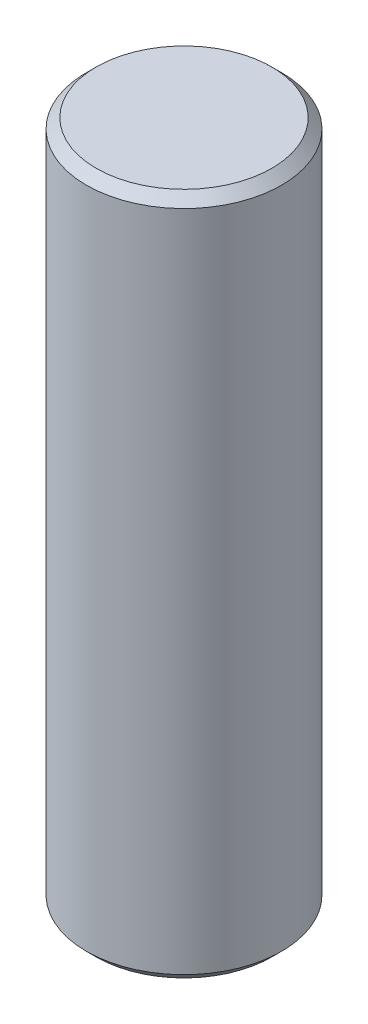
ISO-10303-21;
HEADER;
FILE_DESCRIPTION(('STEP AP214'),'2;1');
FILE_NAME('part.step','',(''),(''),'','','');
FILE_SCHEMA(('AUTOMOTIVE_DESIGN { 1 0 10303 214 1 1 1 1 }'));
ENDSEC;
DATA;
#1=APPLICATION_CONTEXT('core data for automotive mechanical design processes');
#2=APPLICATION_PROTOCOL_DEFINITION('international standard','automotive_design',2000,#1);
#3=PRODUCT_CONTEXT('',#1,'mechanical');
#4=PRODUCT('Part','Part','',(#3));
#5=PRODUCT_RELATED_PRODUCT_CATEGORY('part','',(#4));
#6=PRODUCT_DEFINITION_FORMATION('','',#4);
#7=PRODUCT_DEFINITION_CONTEXT('part definition',#1,'design');
#8=PRODUCT_DEFINITION('design','',#6,#7);
#9=PRODUCT_DEFINITION_SHAPE('','',#8);
#10=(LENGTH_UNIT() NAMED_UNIT(*) SI_UNIT(.MILLI.,.METRE.));
#11=(NAMED_UNIT(*) PLANE_ANGLE_UNIT() SI_UNIT($,.RADIAN.));
#12=(NAMED_UNIT(*) SI_UNIT($,.STERADIAN.) SOLID_ANGLE_UNIT());
#13=UNCERTAINTY_MEASURE_WITH_UNIT(LENGTH_MEASURE(1.E-05),#10,'distance_accuracy_value','');
#14=(GEOMETRIC_REPRESENTATION_CONTEXT(3) GLOBAL_UNCERTAINTY_ASSIGNED_CONTEXT((#13)) GLOBAL_UNIT_ASSIGNED_CONTEXT((#10,
#11,#12)) REPRESENTATION_CONTEXT('',''));
#15=CARTESIAN_POINT('',(0.,0.,0.));
#16=DIRECTION('',(0.,0.,1.));
#17=DIRECTION('',(1.,0.,0.));
#18=AXIS2_PLACEMENT_3D('',#15,#16,#17);
#19=CARTESIAN_POINT('',(0.,14.,0.));
#20=DIRECTION('',(0.,-1.,0.));
#21=DIRECTION('',(0.,0.,-1.));
#22=AXIS2_PLACEMENT_3D('',#19,#20,#21);
#23=CYLINDRICAL_SURFACE('',#22,2.);
#24=CARTESIAN_POINT('',(0.,0.199999999999997,0.));
#25=DIRECTION('',(0.,1.,0.));
#26=DIRECTION('',(0.,0.,1.));
#27=AXIS2_PLACEMENT_3D('',#24,#25,#26);
#28=CIRCLE('',#27,2.);
#29=CARTESIAN_POINT('',(0.,0.199999999999997,2.));
#30=VERTEX_POINT('',#29);
#31=EDGE_CURVE('E47',#30,#30,#28,.T.);
#32=ORIENTED_EDGE('',*,*,#31,.T.);
#33=EDGE_LOOP('',(#32));
#34=FACE_BOUND('',#33,.T.);
#35=CARTESIAN_POINT('',(0.,13.8,0.));
#36=DIRECTION('',(0.,1.,0.));
#37=DIRECTION('',(0.,0.,1.));
#38=AXIS2_PLACEMENT_3D('',#35,#36,#37);
#39=CIRCLE('',#38,2.);
#40=CARTESIAN_POINT('',(0.,13.8,2.));
#41=VERTEX_POINT('',#40);
#42=EDGE_CURVE('E51',#41,#41,#39,.F.);
#43=ORIENTED_EDGE('',*,*,#42,.T.);
#44=EDGE_LOOP('',(#43));
#45=FACE_BOUND('',#44,.T.);
#46=ADVANCED_FACE('F35',(#34,#45),#23,.T.);
#47=CARTESIAN_POINT('',(0.,14.,0.));
#48=DIRECTION('',(0.,1.,0.));
#49=DIRECTION('',(0.,0.,1.));
#50=AXIS2_PLACEMENT_3D('',#47,#48,#49);
#51=PLANE('',#50);
#52=CARTESIAN_POINT('',(0.,14.,0.));
#53=DIRECTION('',(0.,1.,0.));
#54=DIRECTION('',(0.,0.,1.));
#55=AXIS2_PLACEMENT_3D('',#52,#53,#54);
#56=CIRCLE('',#55,1.8);
#57=CARTESIAN_POINT('',(0.,14.,1.8));
#58=VERTEX_POINT('',#57);
#59=EDGE_CURVE('E10',#58,#58,#56,.T.);
#60=ORIENTED_EDGE('',*,*,#59,.T.);
#61=EDGE_LOOP('',(#60));
#62=FACE_BOUND('',#61,.T.);
#63=ADVANCED_FACE('F67',(#62),#51,.T.);
#64=CARTESIAN_POINT('',(0.,0.,0.));
#65=DIRECTION('',(0.,1.,0.));
#66=DIRECTION('',(0.,0.,1.));
#67=AXIS2_PLACEMENT_3D('',#64,#65,#66);
#68=PLANE('',#67);
#69=CARTESIAN_POINT('',(0.,0.,0.));
#70=DIRECTION('',(0.,1.,0.));
#71=DIRECTION('',(0.,0.,1.));
#72=AXIS2_PLACEMENT_3D('',#69,#70,#71);
#73=CIRCLE('',#72,1.8);
#74=CARTESIAN_POINT('',(0.,0.,1.8));
#75=VERTEX_POINT('',#74);
#76=EDGE_CURVE('E43',#75,#75,#73,.F.);
#77=ORIENTED_EDGE('',*,*,#76,.T.);
#78=EDGE_LOOP('',(#77));
#79=FACE_BOUND('',#78,.T.);
#80=ADVANCED_FACE('F64',(#79),#68,.F.);
#81=CARTESIAN_POINT('',(0.,0.199999999999997,0.));
#82=DIRECTION('',(0.,1.,0.));
#83=DIRECTION('',(0.,0.,1.));
#84=AXIS2_PLACEMENT_3D('',#81,#82,#83);
#85=CONICAL_SURFACE('',#84,2.,0.785398163397448);
#86=ORIENTED_EDGE('',*,*,#76,.F.);
#87=EDGE_LOOP('',(#86));
#88=FACE_BOUND('',#87,.T.);
#89=ORIENTED_EDGE('',*,*,#31,.F.);
#90=EDGE_LOOP('',(#89));
#91=FACE_BOUND('',#90,.T.);
#92=ADVANCED_FACE('F60',(#88,#91),#85,.T.);
#93=CARTESIAN_POINT('',(0.,14.,0.));
#94=DIRECTION('',(0.,-1.,0.));
#95=DIRECTION('',(0.,0.,-1.));
#96=AXIS2_PLACEMENT_3D('',#93,#94,#95);
#97=CONICAL_SURFACE('',#96,1.8,0.785398163397448);
#98=ORIENTED_EDGE('',*,*,#42,.F.);
#99=EDGE_LOOP('',(#98));
#100=FACE_BOUND('',#99,.T.);
#101=ORIENTED_EDGE('',*,*,#59,.F.);
#102=EDGE_LOOP('',(#101));
#103=FACE_BOUND('',#102,.T.);
#104=ADVANCED_FACE('F38',(#100,#103),#97,.T.);
#105=CLOSED_SHELL('',(#46,#63,#80,#92,#104));
#106=MANIFOLD_SOLID_BREP('B2',#105);
#107=ADVANCED_BREP_SHAPE_REPRESENTATION('',(#18,#106),#14);
#108=SHAPE_DEFINITION_REPRESENTATION(#9,#107);
ENDSEC;
END-ISO-10303-21;
